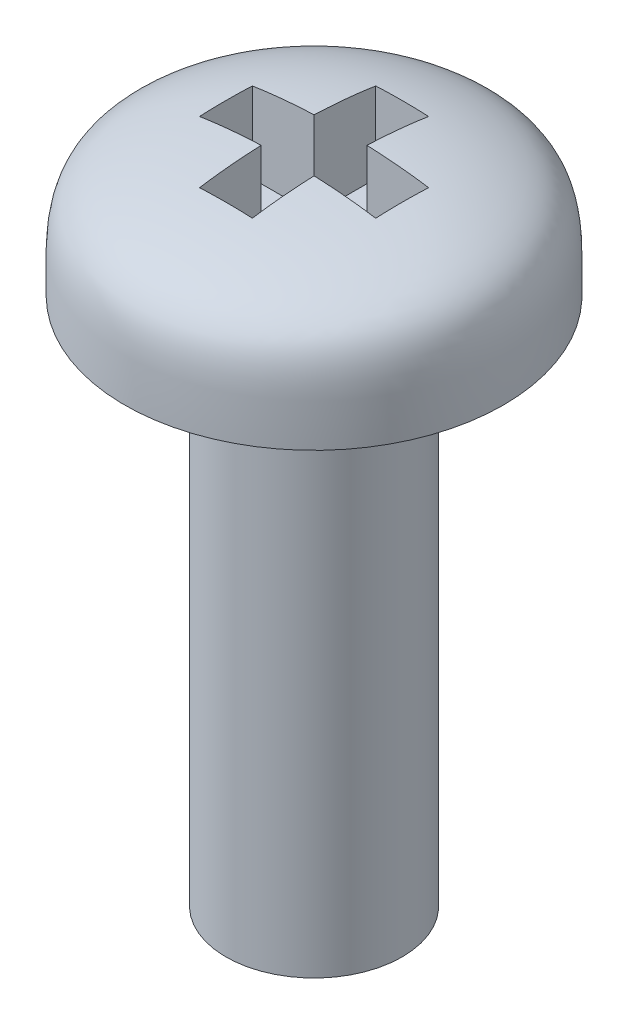
ISO-10303-21;
HEADER;
FILE_DESCRIPTION(('STEP AP214'),'2;1');
FILE_NAME('part.step','',(''),(''),'','','');
FILE_SCHEMA(('AUTOMOTIVE_DESIGN { 1 0 10303 214 1 1 1 1 }'));
ENDSEC;
DATA;
#1=APPLICATION_CONTEXT('core data for automotive mechanical design processes');
#2=APPLICATION_PROTOCOL_DEFINITION('international standard','automotive_design',2000,#1);
#3=PRODUCT_CONTEXT('',#1,'mechanical');
#4=PRODUCT('Part','Part','',(#3));
#5=PRODUCT_RELATED_PRODUCT_CATEGORY('part','',(#4));
#6=PRODUCT_DEFINITION_FORMATION('','',#4);
#7=PRODUCT_DEFINITION_CONTEXT('part definition',#1,'design');
#8=PRODUCT_DEFINITION('design','',#6,#7);
#9=PRODUCT_DEFINITION_SHAPE('','',#8);
#10=(LENGTH_UNIT() NAMED_UNIT(*) SI_UNIT(.MILLI.,.METRE.));
#11=(NAMED_UNIT(*) PLANE_ANGLE_UNIT() SI_UNIT($,.RADIAN.));
#12=(NAMED_UNIT(*) SI_UNIT($,.STERADIAN.) SOLID_ANGLE_UNIT());
#13=UNCERTAINTY_MEASURE_WITH_UNIT(LENGTH_MEASURE(1.E-05),#10,'distance_accuracy_value','');
#14=(GEOMETRIC_REPRESENTATION_CONTEXT(3) GLOBAL_UNCERTAINTY_ASSIGNED_CONTEXT((#13)) GLOBAL_UNIT_ASSIGNED_CONTEXT((#10,
#11,#12)) REPRESENTATION_CONTEXT('',''));
#15=CARTESIAN_POINT('',(0.,0.,0.));
#16=DIRECTION('',(0.,0.,1.));
#17=DIRECTION('',(1.,0.,0.));
#18=AXIS2_PLACEMENT_3D('',#15,#16,#17);
#19=CARTESIAN_POINT('',(2.7305,7.62,0.));
#20=CARTESIAN_POINT('',(2.73018156355849,7.7033126237831,0.));
#21=CARTESIAN_POINT('',(2.7285403176922,8.13271228277097,0.));
#22=CARTESIAN_POINT('',(2.7636195129303,8.89627973030323,0.));
#23=CARTESIAN_POINT('',(1.92180859133705,9.30002876281122,0.));
#24=CARTESIAN_POINT('',(1.06740783240368,9.47670119205479,0.));
#25=CARTESIAN_POINT('',(0.384414805851154,9.50760573295843,0.));
#26=CARTESIAN_POINT('',(0.,9.525,0.));
#27=B_SPLINE_CURVE_WITH_KNOTS('',3,(#19,#20,#21,#22,#23,#24,#25,#26),.UNSPECIFIED.,.F.,.F.,(4,1,
1,1,1,4),(0.,0.0638282256636578,0.328975575239719,0.486188136943679,0.710806875177332,1.),.UNSPECIFIED.);
#28=CARTESIAN_POINT('',(0.,0.,0.));
#29=DIRECTION('',(0.,-1.,0.));
#30=AXIS1_PLACEMENT('',#28,#29);
#31=SURFACE_OF_REVOLUTION('',#27,#30);
#32=CARTESIAN_POINT('',(0.,7.62,0.));
#33=DIRECTION('',(0.,-1.,0.));
#34=DIRECTION('',(1.,0.,0.));
#35=AXIS2_PLACEMENT_3D('',#32,#33,#34);
#36=CIRCLE('',#35,2.7305);
#37=CARTESIAN_POINT('',(2.7305,7.62,0.));
#38=VERTEX_POINT('',#37);
#39=EDGE_CURVE('E268',#38,#38,#36,.T.);
#40=ORIENTED_EDGE('',*,*,#39,.F.);
#41=EDGE_LOOP('',(#40));
#42=FACE_BOUND('',#41,.T.);
#43=CARTESIAN_POINT('',(1.27,9.41237005731236,0.381));
#44=CARTESIAN_POINT('',(1.22883287664601,9.41899817869688,0.381));
#45=CARTESIAN_POINT('',(1.18758973630014,9.42513186294201,0.381));
#46=CARTESIAN_POINT('',(1.10498745411027,9.43652900057813,0.381));
#47=CARTESIAN_POINT('',(1.06362832514968,9.44179254700699,0.381));
#48=CARTESIAN_POINT('',(0.939438826855985,9.45645536764456,0.381));
#49=CARTESIAN_POINT('',(0.85647536038778,9.4647300753099,0.381));
#50=CARTESIAN_POINT('',(0.690515246461683,9.47887873646866,0.381));
#51=CARTESIAN_POINT('',(0.607518979062119,9.48475733921661,0.381));
#52=CARTESIAN_POINT('',(0.441409493377849,9.49459655631974,0.381));
#53=CARTESIAN_POINT('',(0.35829627086812,9.49855709950285,0.380999999999999));
#54=CARTESIAN_POINT('',(0.229318216923235,9.50306020407965,0.381));
#55=CARTESIAN_POINT('',(0.183479159952516,9.50433900979554,0.381000000000001));
#56=CARTESIAN_POINT('',(0.0917612997808398,9.50609073026034,0.380999999999999));
#57=CARTESIAN_POINT('',(0.0458824884983276,9.50656320824457,0.380999999999996));
#58=CARTESIAN_POINT('',(0.,9.50654996511977,0.380999999999989));
#59=B_SPLINE_CURVE_WITH_KNOTS('',3,(#43,#44,#45,#46,#47,#48,#49,#50,#51,#52,#53,#54,#55,#56,#57,
#58),.UNSPECIFIED.,.F.,.F.,(4,2,2,2,2,2,2,4),(0.,0.125083392424993,0.250153401878279,
0.500229754969808,0.749818538522086,0.999416582676706,1.13698121192051,1.2746203323665),.UNSPECIFIED.);
#60=CARTESIAN_POINT('',(1.27,9.41237005731236,0.381));
#61=VERTEX_POINT('',#60);
#62=CARTESIAN_POINT('',(0.380999999999997,9.49718718450539,0.381));
#63=VERTEX_POINT('',#62);
#64=EDGE_CURVE('E227',#61,#63,#59,.T.);
#65=ORIENTED_EDGE('',*,*,#64,.T.);
#66=CARTESIAN_POINT('',(0.381000000000003,9.41237005731237,-1.27));
#67=CARTESIAN_POINT('',(0.381000000000003,9.41899344235941,-1.22886262839127));
#68=CARTESIAN_POINT('',(0.381000000000003,9.42512303322388,-1.18764931456047));
#69=CARTESIAN_POINT('',(0.381000000000002,9.43651314133621,-1.10510688072128));
#70=CARTESIAN_POINT('',(0.381000000000002,9.44177375255298,-1.0637777737266));
#71=CARTESIAN_POINT('',(0.381000000000002,9.45642885565322,-0.939682592961423));
#72=CARTESIAN_POINT('',(0.381000000000001,9.46470049110233,-0.856783660195774));
#73=CARTESIAN_POINT('',(0.381000000000001,9.47885535483785,-0.690828111249259));
#74=CARTESIAN_POINT('',(0.381000000000001,9.48473967444728,-0.607771584594943));
#75=CARTESIAN_POINT('',(0.381,9.49459160119713,-0.441539237536754));
#76=CARTESIAN_POINT('',(0.381,9.49855903236662,-0.358363406883434));
#77=CARTESIAN_POINT('',(0.380999999999999,9.50435505168393,-0.192108921902266));
#78=CARTESIAN_POINT('',(0.380999999999998,9.50618825452077,-0.109030447385074));
#79=CARTESIAN_POINT('',(0.380999999999998,9.50665825520776,0.0155945658440603));
#80=CARTESIAN_POINT('',(0.380999999999999,9.50643497423029,0.0571368629022748));
#81=CARTESIAN_POINT('',(0.380999999999998,9.50527928042989,0.140215319064926));
#82=CARTESIAN_POINT('',(0.380999999999996,9.5043467901283,0.181751477002775));
#83=CARTESIAN_POINT('',(0.380999999999995,9.50057027882983,0.310821544755758));
#84=CARTESIAN_POINT('',(0.380999999999996,9.49675307090846,0.398327235890204));
#85=CARTESIAN_POINT('',(0.380999999999997,9.48703544884981,0.573215294318717));
#86=CARTESIAN_POINT('',(0.380999999999996,9.4811351624101,0.660597668842779));
#87=CARTESIAN_POINT('',(0.380999999999995,9.46676075380089,0.835217384847014));
#88=CARTESIAN_POINT('',(0.380999999999995,9.45828496806261,0.922454595834609));
#89=CARTESIAN_POINT('',(0.380999999999995,9.44311399701598,1.05303423681225));
#90=CARTESIAN_POINT('',(0.380999999999995,9.43764671082129,1.09651959066941));
#91=CARTESIAN_POINT('',(0.380999999999994,9.42575778899949,1.18336444493426));
#92=CARTESIAN_POINT('',(0.380999999999994,9.41933603897351,1.22672392961968));
#93=CARTESIAN_POINT('',(0.380999999999994,9.41237005731236,1.27));
#94=B_SPLINE_CURVE_WITH_KNOTS('',3,(#66,#67,#68,#69,#70,#71,#72,#73,#74,#75,#76,#77,#78,#79,#80,
#81,#82,#83,#84,#85,#86,#87,#88,#89,#90,#91,#92,#93),.UNSPECIFIED.,.F.,.F.,(4,2,2,2,2,2,2,2,2,2,
2,2,2,4),(0.,0.12499307195433,0.249972618664039,0.499855870308955,0.749624762786587,
0.999416579769673,1.24866728075018,1.37328908618474,1.49792450807719,1.76065944727353,
2.02337828300134,2.28626717633747,2.41774096253812,2.54923051947626),.UNSPECIFIED.);
#95=CARTESIAN_POINT('',(0.380999999999994,9.41237005731236,1.27));
#96=VERTEX_POINT('',#95);
#97=EDGE_CURVE('E191',#63,#96,#94,.T.);
#98=ORIENTED_EDGE('',*,*,#97,.T.);
#99=CARTESIAN_POINT('',(0.380999999999994,9.41237005731236,1.27));
#100=CARTESIAN_POINT('',(0.338681704489776,9.41441356575295,1.27));
#101=CARTESIAN_POINT('',(0.296346687992623,9.4161031029448,1.27));
#102=CARTESIAN_POINT('',(0.211676269146634,9.41879285003371,1.27));
#103=CARTESIAN_POINT('',(0.169340877951303,9.41979341018518,1.27));
#104=CARTESIAN_POINT('',(0.0846703227601429,9.42112569080736,1.27));
#105=CARTESIAN_POINT('',(0.0423351613800708,9.42145757927205,1.27));
#106=CARTESIAN_POINT('',(-0.0423351613800734,9.42145757927205,1.27));
#107=CARTESIAN_POINT('',(-0.0846703227601455,9.42112569080735,1.27));
#108=CARTESIAN_POINT('',(-0.169340877951305,9.41979341018518,1.27));
#109=CARTESIAN_POINT('',(-0.211676269146637,9.4187928500337,1.27));
#110=CARTESIAN_POINT('',(-0.296346687992626,9.4161031029448,1.27));
#111=CARTESIAN_POINT('',(-0.338681704489779,9.41441356575295,1.27));
#112=CARTESIAN_POINT('',(-0.380999999999997,9.41237005731237,1.27));
#113=B_SPLINE_CURVE_WITH_KNOTS('',3,(#99,#100,#101,#102,#103,#104,#105,#106,#107,#108,#109,#110,
#111,#112),.UNSPECIFIED.,.F.,.F.,(4,2,2,2,2,2,4),(0.,0.127100783559097,0.25413690524953,
0.381141106988237,0.508145308726944,0.635181430417378,0.762282213976474),.UNSPECIFIED.);
#114=CARTESIAN_POINT('',(-0.381000000000006,9.41237005731237,1.27));
#115=VERTEX_POINT('',#114);
#116=EDGE_CURVE('E11',#96,#115,#113,.T.);
#117=ORIENTED_EDGE('',*,*,#116,.T.);
#118=CARTESIAN_POINT('',(-0.380999999999997,9.41237005731237,1.27));
#119=CARTESIAN_POINT('',(-0.381000000000003,9.42025919525603,1.22095526904135));
#120=CARTESIAN_POINT('',(-0.381000000000005,9.42745639978509,1.1718045563084));
#121=CARTESIAN_POINT('',(-0.381000000000006,9.44064456780527,1.073379818273));
#122=CARTESIAN_POINT('',(-0.381000000000006,9.44663646763645,1.0241059190327));
#123=CARTESIAN_POINT('',(-0.381000000000005,9.45760190275061,0.925460153344841));
#124=CARTESIAN_POINT('',(-0.381000000000005,9.4625757131668,0.876088317015575));
#125=CARTESIAN_POINT('',(-0.381000000000004,9.47162967571414,0.777269509919363));
#126=CARTESIAN_POINT('',(-0.381000000000004,9.47570993915585,0.727822549284392));
#127=CARTESIAN_POINT('',(-0.381000000000004,9.48309926327124,0.628852056589251));
#128=CARTESIAN_POINT('',(-0.381000000000004,9.48640801886856,0.579328502007308));
#129=CARTESIAN_POINT('',(-0.381000000000003,9.49231568423478,0.480207995075825));
#130=CARTESIAN_POINT('',(-0.381000000000003,9.49491415100228,0.430611016229491));
#131=CARTESIAN_POINT('',(-0.381000000000003,9.49718718450469,0.380999999999999));
#132=B_SPLINE_CURVE_WITH_KNOTS('',3,(#118,#119,#120,#121,#122,#123,#124,#125,#126,#127,#128,
#129,#130,#131),.UNSPECIFIED.,.F.,.F.,(4,2,2,2,2,2,4),(0.,0.149013005128816,0.297909798715509,
0.446766300461013,0.59560424835612,0.744500951618474,0.893490309755708),.UNSPECIFIED.);
#133=CARTESIAN_POINT('',(-0.381000000000003,9.49718718450469,0.380999999999997));
#134=VERTEX_POINT('',#133);
#135=EDGE_CURVE('E49',#115,#134,#132,.T.);
#136=ORIENTED_EDGE('',*,*,#135,.T.);
#137=CARTESIAN_POINT('',(-0.381000000000003,9.49718718450469,0.380999999999997));
#138=CARTESIAN_POINT('',(-0.416833174844455,9.49554642962303,0.380999999999997));
#139=CARTESIAN_POINT('',(-0.452659345448636,9.4937360464268,0.380999999999997));
#140=CARTESIAN_POINT('',(-0.560132500445043,9.48775829156665,0.380999999999996));
#141=CARTESIAN_POINT('',(-0.631749770257422,9.48304517398193,0.380999999999996));
#142=CARTESIAN_POINT('',(-0.774853556880564,9.47197019435842,0.380999999999995));
#143=CARTESIAN_POINT('',(-0.846340082846134,9.46560845258634,0.380999999999994));
#144=CARTESIAN_POINT('',(-0.976620828750357,9.45215523736681,0.380999999999993));
#145=CARTESIAN_POINT('',(-1.03544773552465,9.44538610146027,0.380999999999993));
#146=CARTESIAN_POINT('',(-1.15289841913315,9.43019101794087,0.380999999999992));
#147=CARTESIAN_POINT('',(-1.21152215053887,9.42176472141187,0.380999999999992));
#148=CARTESIAN_POINT('',(-1.26999999999999,9.41237005731237,0.380999999999991));
#149=B_SPLINE_CURVE_WITH_KNOTS('',3,(#137,#138,#139,#140,#141,#142,#143,#144,#145,#146,#147,
#148),.UNSPECIFIED.,.F.,.F.,(4,2,2,2,2,4),(0.,0.10761337341424,0.322913224632221,
0.538197374199572,0.715820915529955,0.893481895716787),.UNSPECIFIED.);
#150=CARTESIAN_POINT('',(-1.27,9.41237005731236,0.380999999999991));
#151=VERTEX_POINT('',#150);
#152=EDGE_CURVE('E421',#134,#151,#149,.T.);
#153=ORIENTED_EDGE('',*,*,#152,.T.);
#154=CARTESIAN_POINT('',(-1.27,9.41237005731236,0.380999999999991));
#155=CARTESIAN_POINT('',(-1.27,9.41441356575295,0.338681704489773));
#156=CARTESIAN_POINT('',(-1.27,9.4161031029448,0.296346687992619));
#157=CARTESIAN_POINT('',(-1.27,9.4187928500337,0.211676269146629));
#158=CARTESIAN_POINT('',(-1.27,9.41979341018518,0.169340877951297));
#159=CARTESIAN_POINT('',(-1.27,9.42112569080735,0.0846703227601364));
#160=CARTESIAN_POINT('',(-1.27,9.42145757927205,0.0423351613800638));
#161=CARTESIAN_POINT('',(-1.27,9.42145757927205,-0.0423351613800814));
#162=CARTESIAN_POINT('',(-1.27,9.42112569080735,-0.084670322760154));
#163=CARTESIAN_POINT('',(-1.27,9.41979341018518,-0.169340877951315));
#164=CARTESIAN_POINT('',(-1.27,9.4187928500337,-0.211676269146647));
#165=CARTESIAN_POINT('',(-1.27,9.4161031029448,-0.296346687992637));
#166=CARTESIAN_POINT('',(-1.27,9.41441356575295,-0.33868170448979));
#167=CARTESIAN_POINT('',(-1.27,9.41237005731236,-0.381000000000009));
#168=B_SPLINE_CURVE_WITH_KNOTS('',3,(#154,#155,#156,#157,#158,#159,#160,#161,#162,#163,#164,
#165,#166,#167),.UNSPECIFIED.,.F.,.F.,(4,2,2,2,2,2,4),(0.,0.127100783559098,0.254136905249534,
0.381141106988242,0.50814530872695,0.635181430417386,0.762282213976484),.UNSPECIFIED.);
#169=CARTESIAN_POINT('',(-1.27,9.41237005731236,-0.381000000000009));
#170=VERTEX_POINT('',#169);
#171=EDGE_CURVE('E414',#151,#170,#168,.T.);
#172=ORIENTED_EDGE('',*,*,#171,.T.);
#173=CARTESIAN_POINT('',(-1.27,9.41237005731236,-0.381000000000009));
#174=CARTESIAN_POINT('',(-1.22095526904135,9.42025919525602,-0.381000000000009));
#175=CARTESIAN_POINT('',(-1.17180455630839,9.42745639978508,-0.381000000000008));
#176=CARTESIAN_POINT('',(-1.073379818273,9.44064456780527,-0.381000000000007));
#177=CARTESIAN_POINT('',(-1.02410591903269,9.44663646763645,-0.381000000000007));
#178=CARTESIAN_POINT('',(-0.92546015334484,9.45760190275062,-0.381000000000007));
#179=CARTESIAN_POINT('',(-0.876088317015574,9.4625757131668,-0.381000000000006));
#180=CARTESIAN_POINT('',(-0.777269509919363,9.47162967571414,-0.381000000000005));
#181=CARTESIAN_POINT('',(-0.727822549284393,9.47570993915585,-0.381000000000005));
#182=CARTESIAN_POINT('',(-0.628852056589252,9.48309926327125,-0.381000000000004));
#183=CARTESIAN_POINT('',(-0.57932850200731,9.48640801886856,-0.381000000000004));
#184=CARTESIAN_POINT('',(-0.480207995075828,9.49231568423478,-0.381000000000003));
#185=CARTESIAN_POINT('',(-0.430611016229495,9.49491415100228,-0.381000000000003));
#186=CARTESIAN_POINT('',(-0.381000000000003,9.49718718450469,-0.381000000000003));
#187=B_SPLINE_CURVE_WITH_KNOTS('',3,(#173,#174,#175,#176,#177,#178,#179,#180,#181,#182,#183,
#184,#185,#186),.UNSPECIFIED.,.F.,.F.,(4,2,2,2,2,2,4),(0.,0.149013005128814,0.297909798715506,
0.446766300461009,0.595604248356114,0.744500951618467,0.8934903097557),.UNSPECIFIED.);
#188=CARTESIAN_POINT('',(-0.380999999999998,9.49718718450469,-0.381000000000003));
#189=VERTEX_POINT('',#188);
#190=EDGE_CURVE('E407',#170,#189,#187,.T.);
#191=ORIENTED_EDGE('',*,*,#190,.T.);
#192=CARTESIAN_POINT('',(-0.381000000000001,9.49718718450469,-0.381));
#193=CARTESIAN_POINT('',(-0.380999999999999,9.49554642962303,-0.416833174844452));
#194=CARTESIAN_POINT('',(-0.380999999999997,9.4937360464268,-0.452659345448634));
#195=CARTESIAN_POINT('',(-0.380999999999994,9.48775829156665,-0.560132500445041));
#196=CARTESIAN_POINT('',(-0.380999999999995,9.48304517398193,-0.63174977025742));
#197=CARTESIAN_POINT('',(-0.380999999999994,9.47197019435842,-0.774853556880563));
#198=CARTESIAN_POINT('',(-0.380999999999993,9.46560845258634,-0.846340082846132));
#199=CARTESIAN_POINT('',(-0.380999999999992,9.45215523736681,-0.976620828750356));
#200=CARTESIAN_POINT('',(-0.380999999999991,9.44538610146027,-1.03544773552465));
#201=CARTESIAN_POINT('',(-0.380999999999989,9.43019101794086,-1.15289841913315));
#202=CARTESIAN_POINT('',(-0.380999999999989,9.42176472141187,-1.21152215053886));
#203=CARTESIAN_POINT('',(-0.380999999999988,9.41237005731237,-1.26999999999999));
#204=B_SPLINE_CURVE_WITH_KNOTS('',3,(#192,#193,#194,#195,#196,#197,#198,#199,#200,#201,#202,
#203),.UNSPECIFIED.,.F.,.F.,(4,2,2,2,2,4),(0.,0.10761337341424,0.322913224632222,
0.538197374199574,0.715820915529957,0.89348189571679),.UNSPECIFIED.);
#205=CARTESIAN_POINT('',(-0.380999999999988,9.41237005731237,-1.27));
#206=VERTEX_POINT('',#205);
#207=EDGE_CURVE('E401',#189,#206,#204,.T.);
#208=ORIENTED_EDGE('',*,*,#207,.T.);
#209=CARTESIAN_POINT('',(-0.380999999999987,9.41237005731237,-1.27));
#210=CARTESIAN_POINT('',(-0.338681704489769,9.41441356575295,-1.27));
#211=CARTESIAN_POINT('',(-0.296346687992615,9.4161031029448,-1.27));
#212=CARTESIAN_POINT('',(-0.211676269146625,9.4187928500337,-1.27));
#213=CARTESIAN_POINT('',(-0.169340877951294,9.41979341018518,-1.27));
#214=CARTESIAN_POINT('',(-0.084670322760133,9.42112569080736,-1.27));
#215=CARTESIAN_POINT('',(-0.0423351613800605,9.42145757927205,-1.27));
#216=CARTESIAN_POINT('',(0.0423351613800845,9.42145757927205,-1.27));
#217=CARTESIAN_POINT('',(0.084670322760157,9.42112569080735,-1.27));
#218=CARTESIAN_POINT('',(0.169340877951318,9.41979341018518,-1.27));
#219=CARTESIAN_POINT('',(0.21167626914665,9.41879285003371,-1.27));
#220=CARTESIAN_POINT('',(0.29634668799264,9.4161031029448,-1.27));
#221=CARTESIAN_POINT('',(0.338681704489793,9.41441356575295,-1.27));
#222=CARTESIAN_POINT('',(0.381000000000011,9.41237005731236,-1.27));
#223=B_SPLINE_CURVE_WITH_KNOTS('',3,(#209,#210,#211,#212,#213,#214,#215,#216,#217,#218,#219,
#220,#221,#222),.UNSPECIFIED.,.F.,.F.,(4,2,2,2,2,2,4),(0.,0.127100783559098,0.254136905249533,
0.381141106988241,0.508145308726949,0.635181430417384,0.762282213976482),.UNSPECIFIED.);
#224=CARTESIAN_POINT('',(0.381000000000012,9.41237005731236,-1.27));
#225=VERTEX_POINT('',#224);
#226=EDGE_CURVE('E151',#206,#225,#223,.T.);
#227=ORIENTED_EDGE('',*,*,#226,.T.);
#228=CARTESIAN_POINT('',(0.381,9.49718718450467,-0.381));
#229=VERTEX_POINT('',#228);
#230=EDGE_CURVE('E200',#225,#229,#94,.T.);
#231=ORIENTED_EDGE('',*,*,#230,.T.);
#232=CARTESIAN_POINT('',(0.,9.50654996511977,-0.381));
#233=CARTESIAN_POINT('',(0.0253947380378626,9.50655409653829,-0.380999999999997));
#234=CARTESIAN_POINT('',(0.0507892014899554,9.50641155017517,-0.380999999999998));
#235=CARTESIAN_POINT('',(0.126976158583279,9.50558262757322,-0.381000000000004));
#236=CARTESIAN_POINT('',(0.177764633228209,9.50449489055779,-0.381000000000012));
#237=CARTESIAN_POINT('',(0.279318331048501,9.50145629150008,-0.380999999999988));
#238=CARTESIAN_POINT('',(0.330083551760946,9.49950535288247,-0.380999999999957));
#239=CARTESIAN_POINT('',(0.455225724922408,9.49380777855731,-0.38099999999994));
#240=CARTESIAN_POINT('',(0.529584254166463,9.48964800368878,-0.380999999999984));
#241=CARTESIAN_POINT('',(0.678189130312542,9.4796962954042,-0.381000000000016));
#242=CARTESIAN_POINT('',(0.752435482752151,9.47390444539033,-0.381000000000004));
#243=CARTESIAN_POINT('',(0.900747544169224,9.46031695788955,-0.380999999999996));
#244=CARTESIAN_POINT('',(0.974813260010056,9.45252139777068,-0.380999999999999));
#245=CARTESIAN_POINT('',(1.08569679555728,9.43898484654014,-0.381));
#246=CARTESIAN_POINT('',(1.12262742097772,9.43416463653817,-0.381));
#247=CARTESIAN_POINT('',(1.19639254886389,9.42381893107226,-0.381));
#248=CARTESIAN_POINT('',(1.2332270431718,9.41829337761838,-0.381));
#249=CARTESIAN_POINT('',(1.27,9.41237005731236,-0.381));
#250=B_SPLINE_CURVE_WITH_KNOTS('',3,(#232,#233,#234,#235,#236,#237,#238,#239,#240,#241,#242,
#243,#244,#245,#246,#247,#248,#249),.UNSPECIFIED.,.F.,.F.,(4,2,2,2,2,2,2,2,4),(0.,
0.0761834544880405,0.228573117083345,0.380976301005579,0.604383405016101,0.827779094562591,
1.05116615956169,1.16289177709399,1.27462658608927),.UNSPECIFIED.);
#251=CARTESIAN_POINT('',(1.27,9.41237005731236,-0.381));
#252=VERTEX_POINT('',#251);
#253=EDGE_CURVE('E64',#229,#252,#250,.T.);
#254=ORIENTED_EDGE('',*,*,#253,.T.);
#255=CARTESIAN_POINT('',(1.27,9.41237005731236,-0.381));
#256=CARTESIAN_POINT('',(1.27,9.41441356575295,-0.338681704489781));
#257=CARTESIAN_POINT('',(1.27,9.4161031029448,-0.296346687992628));
#258=CARTESIAN_POINT('',(1.27,9.4187928500337,-0.211676269146638));
#259=CARTESIAN_POINT('',(1.27,9.41979341018518,-0.169340877951306));
#260=CARTESIAN_POINT('',(1.27,9.42112569080736,-0.0846703227601448));
#261=CARTESIAN_POINT('',(1.27,9.42145757927205,-0.0423351613800722));
#262=CARTESIAN_POINT('',(1.27,9.42145757927205,0.042335161380073));
#263=CARTESIAN_POINT('',(1.27,9.42112569080735,0.0846703227601456));
#264=CARTESIAN_POINT('',(1.27,9.41979341018518,0.169340877951306));
#265=CARTESIAN_POINT('',(1.27,9.41879285003371,0.211676269146638));
#266=CARTESIAN_POINT('',(1.27,9.4161031029448,0.296346687992629));
#267=CARTESIAN_POINT('',(1.27,9.41441356575295,0.338681704489782));
#268=CARTESIAN_POINT('',(1.27,9.41237005731236,0.381000000000001));
#269=B_SPLINE_CURVE_WITH_KNOTS('',3,(#255,#256,#257,#258,#259,#260,#261,#262,#263,#264,#265,
#266,#267,#268),.UNSPECIFIED.,.F.,.F.,(4,2,2,2,2,2,4),(0.,0.127100783559098,0.254136905249534,
0.381141106988242,0.50814530872695,0.635181430417386,0.762282213976484),.UNSPECIFIED.);
#270=EDGE_CURVE('E235',#252,#61,#269,.T.);
#271=ORIENTED_EDGE('',*,*,#270,.T.);
#272=EDGE_LOOP('',(#65,#98,#117,#136,#153,#172,#191,#208,#227,#231,#254,#271));
#273=FACE_BOUND('',#272,.T.);
#274=ADVANCED_FACE('F35',(#42,#273),#31,.F.);
#275=CARTESIAN_POINT('',(0.,8.255,-0.381));
#276=DIRECTION('',(0.,0.,1.));
#277=DIRECTION('',(1.,0.,0.));
#278=AXIS2_PLACEMENT_3D('',#275,#276,#277);
#279=PLANE('',#278);
#280=ORIENTED_EDGE('',*,*,#253,.F.);
#281=DIRECTION('',(0.,-1.,0.));
#282=VECTOR('',#281,1.);
#283=CARTESIAN_POINT('',(0.381,8.255,-0.381));
#284=LINE('',#283,#282);
#285=CARTESIAN_POINT('',(0.381,8.255,-0.381));
#286=VERTEX_POINT('',#285);
#287=EDGE_CURVE('E199',#229,#286,#284,.T.);
#288=ORIENTED_EDGE('',*,*,#287,.T.);
#289=DIRECTION('',(1.,0.,0.));
#290=VECTOR('',#289,1.);
#291=CARTESIAN_POINT('',(0.,8.255,-0.381));
#292=LINE('',#291,#290);
#293=CARTESIAN_POINT('',(1.27,8.255,-0.381));
#294=VERTEX_POINT('',#293);
#295=EDGE_CURVE('E265',#286,#294,#292,.T.);
#296=ORIENTED_EDGE('',*,*,#295,.T.);
#297=DIRECTION('',(0.,1.,0.));
#298=VECTOR('',#297,1.);
#299=CARTESIAN_POINT('',(1.27,8.255,-0.381));
#300=LINE('',#299,#298);
#301=EDGE_CURVE('E264',#294,#252,#300,.T.);
#302=ORIENTED_EDGE('',*,*,#301,.T.);
#303=EDGE_LOOP('',(#280,#288,#296,#302));
#304=FACE_BOUND('',#303,.T.);
#305=ADVANCED_FACE('F223',(#304),#279,.T.);
#306=CARTESIAN_POINT('',(0.,8.255,0.381));
#307=DIRECTION('',(0.,0.,-1.));
#308=DIRECTION('',(-1.,0.,0.));
#309=AXIS2_PLACEMENT_3D('',#306,#307,#308);
#310=PLANE('',#309);
#311=DIRECTION('',(-1.,0.,0.));
#312=VECTOR('',#311,1.);
#313=CARTESIAN_POINT('',(0.,8.255,0.381));
#314=LINE('',#313,#312);
#315=CARTESIAN_POINT('',(1.27,8.255,0.381));
#316=VERTEX_POINT('',#315);
#317=CARTESIAN_POINT('',(0.380999999999999,8.255,0.381));
#318=VERTEX_POINT('',#317);
#319=EDGE_CURVE('E275',#316,#318,#314,.T.);
#320=ORIENTED_EDGE('',*,*,#319,.T.);
#321=DIRECTION('',(0.,1.,0.));
#322=VECTOR('',#321,1.);
#323=CARTESIAN_POINT('',(0.380999999999997,8.255,0.381));
#324=LINE('',#323,#322);
#325=EDGE_CURVE('E188',#318,#63,#324,.T.);
#326=ORIENTED_EDGE('',*,*,#325,.T.);
#327=ORIENTED_EDGE('',*,*,#64,.F.);
#328=DIRECTION('',(0.,1.,0.));
#329=VECTOR('',#328,1.);
#330=CARTESIAN_POINT('',(1.27,8.255,0.381));
#331=LINE('',#330,#329);
#332=EDGE_CURVE('E269',#316,#61,#331,.T.);
#333=ORIENTED_EDGE('',*,*,#332,.F.);
#334=EDGE_LOOP('',(#320,#326,#327,#333));
#335=FACE_BOUND('',#334,.T.);
#336=ADVANCED_FACE('F219',(#335),#310,.T.);
#337=CARTESIAN_POINT('',(0.,0.,0.));
#338=DIRECTION('',(0.,-1.,0.));
#339=DIRECTION('',(1.,0.,0.));
#340=AXIS2_PLACEMENT_3D('',#337,#338,#339);
#341=PLANE('',#340);
#342=CARTESIAN_POINT('',(0.,0.,0.));
#343=DIRECTION('',(0.,-1.,0.));
#344=DIRECTION('',(1.,0.,0.));
#345=AXIS2_PLACEMENT_3D('',#342,#343,#344);
#346=CIRCLE('',#345,1.27);
#347=CARTESIAN_POINT('',(1.27,0.,0.));
#348=VERTEX_POINT('',#347);
#349=EDGE_CURVE('E236',#348,#348,#346,.T.);
#350=ORIENTED_EDGE('',*,*,#349,.T.);
#351=EDGE_LOOP('',(#350));
#352=FACE_BOUND('',#351,.T.);
#353=ADVANCED_FACE('F37',(#352),#341,.T.);
#354=CARTESIAN_POINT('',(0.,0.,0.));
#355=DIRECTION('',(0.,-1.,0.));
#356=DIRECTION('',(1.,0.,0.));
#357=AXIS2_PLACEMENT_3D('',#354,#355,#356);
#358=CYLINDRICAL_SURFACE('',#357,1.27);
#359=CARTESIAN_POINT('',(0.,7.62,0.));
#360=DIRECTION('',(0.,-1.,0.));
#361=DIRECTION('',(1.,0.,0.));
#362=AXIS2_PLACEMENT_3D('',#359,#360,#361);
#363=CIRCLE('',#362,1.27);
#364=CARTESIAN_POINT('',(1.27,7.62,0.));
#365=VERTEX_POINT('',#364);
#366=EDGE_CURVE('E272',#365,#365,#363,.T.);
#367=ORIENTED_EDGE('',*,*,#366,.T.);
#368=EDGE_LOOP('',(#367));
#369=FACE_BOUND('',#368,.T.);
#370=ORIENTED_EDGE('',*,*,#349,.F.);
#371=EDGE_LOOP('',(#370));
#372=FACE_BOUND('',#371,.T.);
#373=ADVANCED_FACE('F291',(#369,#372),#358,.T.);
#374=CARTESIAN_POINT('',(1.27,7.62,0.));
#375=DIRECTION('',(0.,-1.,0.));
#376=DIRECTION('',(1.,0.,0.));
#377=AXIS2_PLACEMENT_3D('',#374,#375,#376);
#378=PLANE('',#377);
#379=ORIENTED_EDGE('',*,*,#39,.T.);
#380=EDGE_LOOP('',(#379));
#381=FACE_BOUND('',#380,.T.);
#382=ORIENTED_EDGE('',*,*,#366,.F.);
#383=EDGE_LOOP('',(#382));
#384=FACE_BOUND('',#383,.T.);
#385=ADVANCED_FACE('F293',(#381,#384),#378,.T.);
#386=CARTESIAN_POINT('',(1.27,8.255,0.381));
#387=DIRECTION('',(-1.,0.,0.));
#388=DIRECTION('',(0.,-1.,0.));
#389=AXIS2_PLACEMENT_3D('',#386,#387,#388);
#390=PLANE('',#389);
#391=ORIENTED_EDGE('',*,*,#301,.F.);
#392=DIRECTION('',(0.,0.,1.));
#393=VECTOR('',#392,1.);
#394=CARTESIAN_POINT('',(1.27,8.255,0.381));
#395=LINE('',#394,#393);
#396=EDGE_CURVE('E441',#294,#316,#395,.T.);
#397=ORIENTED_EDGE('',*,*,#396,.T.);
#398=ORIENTED_EDGE('',*,*,#332,.T.);
#399=ORIENTED_EDGE('',*,*,#270,.F.);
#400=EDGE_LOOP('',(#391,#397,#398,#399));
#401=FACE_BOUND('',#400,.T.);
#402=ADVANCED_FACE('F218',(#401),#390,.T.);
#403=CARTESIAN_POINT('',(0.,8.255,-0.381));
#404=DIRECTION('',(0.,-1.,0.));
#405=DIRECTION('',(0.,0.,-1.));
#406=AXIS2_PLACEMENT_3D('',#403,#404,#405);
#407=PLANE('',#406);
#408=ORIENTED_EDGE('',*,*,#295,.F.);
#409=DIRECTION('',(0.,0.,1.));
#410=VECTOR('',#409,1.);
#411=CARTESIAN_POINT('',(0.380999999999999,8.255,0.));
#412=LINE('',#411,#410);
#413=CARTESIAN_POINT('',(0.381000000000012,8.255,-1.27));
#414=VERTEX_POINT('',#413);
#415=EDGE_CURVE('E156',#414,#286,#412,.T.);
#416=ORIENTED_EDGE('',*,*,#415,.F.);
#417=DIRECTION('',(1.,0.,0.));
#418=VECTOR('',#417,1.);
#419=CARTESIAN_POINT('',(0.381000000000012,8.255,-1.27));
#420=LINE('',#419,#418);
#421=CARTESIAN_POINT('',(-0.380999999999988,8.255,-1.27));
#422=VERTEX_POINT('',#421);
#423=EDGE_CURVE('E143',#422,#414,#420,.T.);
#424=ORIENTED_EDGE('',*,*,#423,.F.);
#425=DIRECTION('',(0.,0.,-1.));
#426=VECTOR('',#425,1.);
#427=CARTESIAN_POINT('',(-0.381000000000001,8.255,0.));
#428=LINE('',#427,#426);
#429=CARTESIAN_POINT('',(-0.380999999999999,8.255,-0.381000000000003));
#430=VERTEX_POINT('',#429);
#431=EDGE_CURVE('E133',#430,#422,#428,.T.);
#432=ORIENTED_EDGE('',*,*,#431,.F.);
#433=DIRECTION('',(1.,0.,0.));
#434=VECTOR('',#433,1.);
#435=CARTESIAN_POINT('',(0.,8.255,-0.381));
#436=LINE('',#435,#434);
#437=CARTESIAN_POINT('',(-1.27,8.255,-0.381000000000009));
#438=VERTEX_POINT('',#437);
#439=EDGE_CURVE('E165',#438,#430,#436,.T.);
#440=ORIENTED_EDGE('',*,*,#439,.F.);
#441=DIRECTION('',(0.,0.,-1.));
#442=VECTOR('',#441,1.);
#443=CARTESIAN_POINT('',(-1.27,8.255,-0.381000000000009));
#444=LINE('',#443,#442);
#445=CARTESIAN_POINT('',(-1.27,8.255,0.380999999999991));
#446=VERTEX_POINT('',#445);
#447=EDGE_CURVE('E163',#446,#438,#444,.T.);
#448=ORIENTED_EDGE('',*,*,#447,.F.);
#449=DIRECTION('',(-1.,0.,0.));
#450=VECTOR('',#449,1.);
#451=CARTESIAN_POINT('',(0.,8.255,0.381));
#452=LINE('',#451,#450);
#453=CARTESIAN_POINT('',(-0.381000000000003,8.255,0.380999999999999));
#454=VERTEX_POINT('',#453);
#455=EDGE_CURVE('E161',#454,#446,#452,.T.);
#456=ORIENTED_EDGE('',*,*,#455,.F.);
#457=DIRECTION('',(0.,0.,-1.));
#458=VECTOR('',#457,1.);
#459=CARTESIAN_POINT('',(-0.381000000000001,8.255,0.));
#460=LINE('',#459,#458);
#461=CARTESIAN_POINT('',(-0.381000000000006,8.255,1.27));
#462=VERTEX_POINT('',#461);
#463=EDGE_CURVE('E179',#462,#454,#460,.T.);
#464=ORIENTED_EDGE('',*,*,#463,.F.);
#465=DIRECTION('',(-1.,0.,0.));
#466=VECTOR('',#465,1.);
#467=CARTESIAN_POINT('',(-0.381000000000006,8.255,1.27));
#468=LINE('',#467,#466);
#469=CARTESIAN_POINT('',(0.380999999999994,8.255,1.27));
#470=VERTEX_POINT('',#469);
#471=EDGE_CURVE('E177',#470,#462,#468,.T.);
#472=ORIENTED_EDGE('',*,*,#471,.F.);
#473=EDGE_CURVE('E56',#318,#470,#412,.T.);
#474=ORIENTED_EDGE('',*,*,#473,.F.);
#475=ORIENTED_EDGE('',*,*,#319,.F.);
#476=ORIENTED_EDGE('',*,*,#396,.F.);
#477=EDGE_LOOP('',(#408,#416,#424,#432,#440,#448,#456,#464,#472,#474,#475,#476));
#478=FACE_BOUND('',#477,.T.);
#479=ADVANCED_FACE('F155',(#478),#407,.F.);
#480=CARTESIAN_POINT('',(0.380999999999999,8.255,0.));
#481=DIRECTION('',(-1.,0.,0.));
#482=DIRECTION('',(0.,0.,1.));
#483=AXIS2_PLACEMENT_3D('',#480,#481,#482);
#484=PLANE('',#483);
#485=DIRECTION('',(0.,1.,0.));
#486=VECTOR('',#485,1.);
#487=CARTESIAN_POINT('',(0.381000000000012,8.255,-1.27));
#488=LINE('',#487,#486);
#489=EDGE_CURVE('E152',#414,#225,#488,.T.);
#490=ORIENTED_EDGE('',*,*,#489,.F.);
#491=ORIENTED_EDGE('',*,*,#415,.T.);
#492=ORIENTED_EDGE('',*,*,#287,.F.);
#493=ORIENTED_EDGE('',*,*,#230,.F.);
#494=EDGE_LOOP('',(#490,#491,#492,#493));
#495=FACE_BOUND('',#494,.T.);
#496=ADVANCED_FACE('F213',(#495),#484,.T.);
#497=CARTESIAN_POINT('',(-0.381000000000001,8.255,0.));
#498=DIRECTION('',(1.,0.,0.));
#499=DIRECTION('',(0.,0.,-1.));
#500=AXIS2_PLACEMENT_3D('',#497,#498,#499);
#501=PLANE('',#500);
#502=DIRECTION('',(0.,1.,0.));
#503=VECTOR('',#502,1.);
#504=CARTESIAN_POINT('',(-0.381000000000006,8.255,1.27));
#505=LINE('',#504,#503);
#506=EDGE_CURVE('E182',#462,#115,#505,.T.);
#507=ORIENTED_EDGE('',*,*,#506,.F.);
#508=ORIENTED_EDGE('',*,*,#463,.T.);
#509=DIRECTION('',(0.,1.,0.));
#510=VECTOR('',#509,1.);
#511=CARTESIAN_POINT('',(-0.381000000000003,8.255,0.380999999999997));
#512=LINE('',#511,#510);
#513=EDGE_CURVE('E173',#454,#134,#512,.T.);
#514=ORIENTED_EDGE('',*,*,#513,.T.);
#515=ORIENTED_EDGE('',*,*,#135,.F.);
#516=EDGE_LOOP('',(#507,#508,#514,#515));
#517=FACE_BOUND('',#516,.T.);
#518=ADVANCED_FACE('F211',(#517),#501,.T.);
#519=ORIENTED_EDGE('',*,*,#325,.F.);
#520=ORIENTED_EDGE('',*,*,#473,.T.);
#521=DIRECTION('',(0.,1.,0.));
#522=VECTOR('',#521,1.);
#523=CARTESIAN_POINT('',(0.380999999999994,8.255,1.27));
#524=LINE('',#523,#522);
#525=EDGE_CURVE('E185',#470,#96,#524,.T.);
#526=ORIENTED_EDGE('',*,*,#525,.T.);
#527=ORIENTED_EDGE('',*,*,#97,.F.);
#528=EDGE_LOOP('',(#519,#520,#526,#527));
#529=FACE_BOUND('',#528,.T.);
#530=ADVANCED_FACE('F206',(#529),#484,.T.);
#531=CARTESIAN_POINT('',(-0.381000000000006,8.255,1.27));
#532=DIRECTION('',(0.,0.,-1.));
#533=DIRECTION('',(-1.,0.,0.));
#534=AXIS2_PLACEMENT_3D('',#531,#532,#533);
#535=PLANE('',#534);
#536=ORIENTED_EDGE('',*,*,#525,.F.);
#537=ORIENTED_EDGE('',*,*,#471,.T.);
#538=ORIENTED_EDGE('',*,*,#506,.T.);
#539=ORIENTED_EDGE('',*,*,#116,.F.);
#540=EDGE_LOOP('',(#536,#537,#538,#539));
#541=FACE_BOUND('',#540,.T.);
#542=ADVANCED_FACE('F210',(#541),#535,.T.);
#543=CARTESIAN_POINT('',(0.,8.255,0.381));
#544=DIRECTION('',(0.,0.,-1.));
#545=DIRECTION('',(-1.,0.,0.));
#546=AXIS2_PLACEMENT_3D('',#543,#544,#545);
#547=PLANE('',#546);
#548=ORIENTED_EDGE('',*,*,#513,.F.);
#549=ORIENTED_EDGE('',*,*,#455,.T.);
#550=DIRECTION('',(0.,1.,0.));
#551=VECTOR('',#550,1.);
#552=CARTESIAN_POINT('',(-1.27,8.255,0.380999999999991));
#553=LINE('',#552,#551);
#554=EDGE_CURVE('E170',#446,#151,#553,.T.);
#555=ORIENTED_EDGE('',*,*,#554,.T.);
#556=ORIENTED_EDGE('',*,*,#152,.F.);
#557=EDGE_LOOP('',(#548,#549,#555,#556));
#558=FACE_BOUND('',#557,.T.);
#559=ADVANCED_FACE('F350',(#558),#547,.T.);
#560=CARTESIAN_POINT('',(0.,8.255,-0.381));
#561=DIRECTION('',(0.,0.,1.));
#562=DIRECTION('',(1.,0.,0.));
#563=AXIS2_PLACEMENT_3D('',#560,#561,#562);
#564=PLANE('',#563);
#565=DIRECTION('',(0.,1.,0.));
#566=VECTOR('',#565,1.);
#567=CARTESIAN_POINT('',(-1.27,8.255,-0.381000000000009));
#568=LINE('',#567,#566);
#569=EDGE_CURVE('E167',#438,#170,#568,.T.);
#570=ORIENTED_EDGE('',*,*,#569,.F.);
#571=ORIENTED_EDGE('',*,*,#439,.T.);
#572=DIRECTION('',(0.,1.,0.));
#573=VECTOR('',#572,1.);
#574=CARTESIAN_POINT('',(-0.380999999999997,8.255,-0.381000000000003));
#575=LINE('',#574,#573);
#576=EDGE_CURVE('E139',#430,#189,#575,.T.);
#577=ORIENTED_EDGE('',*,*,#576,.T.);
#578=ORIENTED_EDGE('',*,*,#190,.F.);
#579=EDGE_LOOP('',(#570,#571,#577,#578));
#580=FACE_BOUND('',#579,.T.);
#581=ADVANCED_FACE('F359',(#580),#564,.T.);
#582=CARTESIAN_POINT('',(-1.27,8.255,-0.381000000000009));
#583=DIRECTION('',(1.,0.,0.));
#584=DIRECTION('',(0.,0.,-1.));
#585=AXIS2_PLACEMENT_3D('',#582,#583,#584);
#586=PLANE('',#585);
#587=ORIENTED_EDGE('',*,*,#554,.F.);
#588=ORIENTED_EDGE('',*,*,#447,.T.);
#589=ORIENTED_EDGE('',*,*,#569,.T.);
#590=ORIENTED_EDGE('',*,*,#171,.F.);
#591=EDGE_LOOP('',(#587,#588,#589,#590));
#592=FACE_BOUND('',#591,.T.);
#593=ADVANCED_FACE('F369',(#592),#586,.T.);
#594=CARTESIAN_POINT('',(-0.381000000000001,8.255,0.));
#595=DIRECTION('',(1.,0.,0.));
#596=DIRECTION('',(0.,0.,-1.));
#597=AXIS2_PLACEMENT_3D('',#594,#595,#596);
#598=PLANE('',#597);
#599=ORIENTED_EDGE('',*,*,#576,.F.);
#600=ORIENTED_EDGE('',*,*,#431,.T.);
#601=DIRECTION('',(0.,1.,0.));
#602=VECTOR('',#601,1.);
#603=CARTESIAN_POINT('',(-0.380999999999988,8.255,-1.27));
#604=LINE('',#603,#602);
#605=EDGE_CURVE('E136',#422,#206,#604,.T.);
#606=ORIENTED_EDGE('',*,*,#605,.T.);
#607=ORIENTED_EDGE('',*,*,#207,.F.);
#608=EDGE_LOOP('',(#599,#600,#606,#607));
#609=FACE_BOUND('',#608,.T.);
#610=ADVANCED_FACE('F135',(#609),#598,.T.);
#611=CARTESIAN_POINT('',(0.381000000000012,8.255,-1.27));
#612=DIRECTION('',(0.,0.,1.));
#613=DIRECTION('',(1.,0.,0.));
#614=AXIS2_PLACEMENT_3D('',#611,#612,#613);
#615=PLANE('',#614);
#616=ORIENTED_EDGE('',*,*,#605,.F.);
#617=ORIENTED_EDGE('',*,*,#423,.T.);
#618=ORIENTED_EDGE('',*,*,#489,.T.);
#619=ORIENTED_EDGE('',*,*,#226,.F.);
#620=EDGE_LOOP('',(#616,#617,#618,#619));
#621=FACE_BOUND('',#620,.T.);
#622=ADVANCED_FACE('F147',(#621),#615,.T.);
#623=CLOSED_SHELL('',(#274,#305,#336,#353,#373,#385,#402,#479,#496,#518,#530,#542,#559,#581,
#593,#610,#622));
#624=MANIFOLD_SOLID_BREP('B2',#623);
#625=ADVANCED_BREP_SHAPE_REPRESENTATION('',(#18,#624),#14);
#626=SHAPE_DEFINITION_REPRESENTATION(#9,#625);
ENDSEC;
END-ISO-10303-21;
